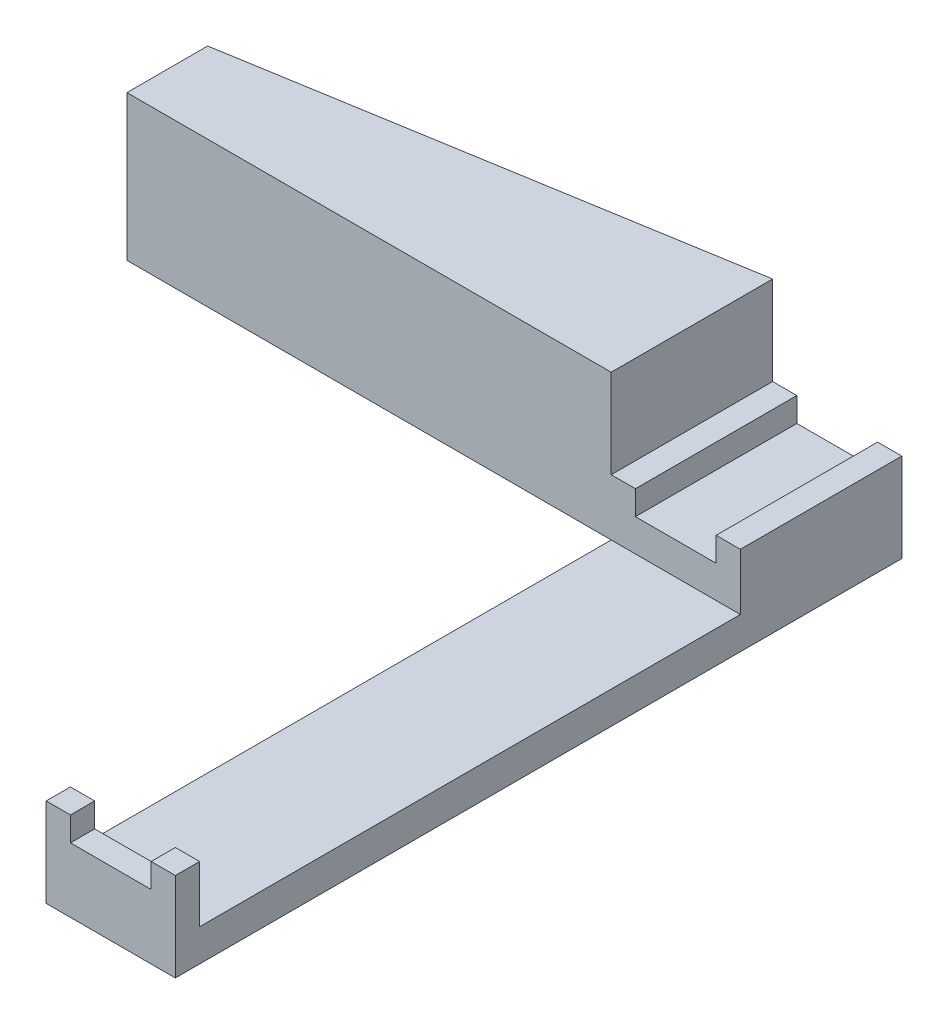
ISO-10303-21;
HEADER;
FILE_DESCRIPTION(('STEP AP214'),'2;1');
FILE_NAME('part.step','',(''),(''),'','','');
FILE_SCHEMA(('AUTOMOTIVE_DESIGN { 1 0 10303 214 1 1 1 1 }'));
ENDSEC;
DATA;
#1=APPLICATION_CONTEXT('core data for automotive mechanical design processes');
#2=APPLICATION_PROTOCOL_DEFINITION('international standard','automotive_design',2000,#1);
#3=PRODUCT_CONTEXT('',#1,'mechanical');
#4=PRODUCT('Part','Part','',(#3));
#5=PRODUCT_RELATED_PRODUCT_CATEGORY('part','',(#4));
#6=PRODUCT_DEFINITION_FORMATION('','',#4);
#7=PRODUCT_DEFINITION_CONTEXT('part definition',#1,'design');
#8=PRODUCT_DEFINITION('design','',#6,#7);
#9=PRODUCT_DEFINITION_SHAPE('','',#8);
#10=(LENGTH_UNIT() NAMED_UNIT(*) SI_UNIT(.MILLI.,.METRE.));
#11=(NAMED_UNIT(*) PLANE_ANGLE_UNIT() SI_UNIT($,.RADIAN.));
#12=(NAMED_UNIT(*) SI_UNIT($,.STERADIAN.) SOLID_ANGLE_UNIT());
#13=UNCERTAINTY_MEASURE_WITH_UNIT(LENGTH_MEASURE(1.E-05),#10,'distance_accuracy_value','');
#14=(GEOMETRIC_REPRESENTATION_CONTEXT(3) GLOBAL_UNCERTAINTY_ASSIGNED_CONTEXT((#13)) GLOBAL_UNIT_ASSIGNED_CONTEXT((#10,
#11,#12)) REPRESENTATION_CONTEXT('',''));
#15=CARTESIAN_POINT('',(0.,0.,0.));
#16=DIRECTION('',(0.,0.,1.));
#17=DIRECTION('',(1.,0.,0.));
#18=AXIS2_PLACEMENT_3D('',#15,#16,#17);
#19=CARTESIAN_POINT('',(0.,12.,-5.));
#20=DIRECTION('',(1.,0.,0.));
#21=DIRECTION('',(0.,0.,-1.));
#22=AXIS2_PLACEMENT_3D('',#19,#20,#21);
#23=PLANE('',#22);
#24=DIRECTION('',(0.,0.,-1.));
#25=VECTOR('',#24,1.);
#26=CARTESIAN_POINT('',(0.,5.,-3.));
#27=LINE('',#26,#25);
#28=CARTESIAN_POINT('',(0.,5.,-3.));
#29=VERTEX_POINT('',#28);
#30=CARTESIAN_POINT('',(0.,5.,-5.));
#31=VERTEX_POINT('',#30);
#32=EDGE_CURVE('E181',#29,#31,#27,.T.);
#33=ORIENTED_EDGE('',*,*,#32,.F.);
#34=DIRECTION('',(0.,-1.,0.));
#35=VECTOR('',#34,1.);
#36=CARTESIAN_POINT('',(0.,5.,-3.));
#37=LINE('',#36,#35);
#38=CARTESIAN_POINT('',(0.,2.,-3.));
#39=VERTEX_POINT('',#38);
#40=EDGE_CURVE('E381',#29,#39,#37,.T.);
#41=ORIENTED_EDGE('',*,*,#40,.T.);
#42=DIRECTION('',(0.,0.,-1.));
#43=VECTOR('',#42,1.);
#44=CARTESIAN_POINT('',(0.,2.,-5.));
#45=LINE('',#44,#43);
#46=CARTESIAN_POINT('',(0.,2.,0.));
#47=VERTEX_POINT('',#46);
#48=EDGE_CURVE('E372',#47,#39,#45,.T.);
#49=ORIENTED_EDGE('',*,*,#48,.F.);
#50=DIRECTION('',(0.,-1.,0.));
#51=VECTOR('',#50,1.);
#52=CARTESIAN_POINT('',(0.,12.,0.));
#53=LINE('',#52,#51);
#54=CARTESIAN_POINT('',(0.,11.,0.));
#55=VERTEX_POINT('',#54);
#56=EDGE_CURVE('E220',#55,#47,#53,.T.);
#57=ORIENTED_EDGE('',*,*,#56,.F.);
#58=DIRECTION('',(0.,0.,1.));
#59=VECTOR('',#58,1.);
#60=CARTESIAN_POINT('',(0.,11.,0.));
#61=LINE('',#60,#59);
#62=CARTESIAN_POINT('',(0.,11.,-5.));
#63=VERTEX_POINT('',#62);
#64=EDGE_CURVE('E205',#63,#55,#61,.T.);
#65=ORIENTED_EDGE('',*,*,#64,.F.);
#66=DIRECTION('',(0.,-1.,0.));
#67=VECTOR('',#66,1.);
#68=CARTESIAN_POINT('',(0.,12.,-5.));
#69=LINE('',#68,#67);
#70=EDGE_CURVE('E198',#63,#31,#69,.T.);
#71=ORIENTED_EDGE('',*,*,#70,.T.);
#72=EDGE_LOOP('',(#33,#41,#49,#57,#65,#71));
#73=FACE_BOUND('',#72,.T.);
#74=ADVANCED_FACE('F35',(#73),#23,.F.);
#75=CARTESIAN_POINT('',(0.,12.,0.));
#76=DIRECTION('',(0.,0.,-1.));
#77=DIRECTION('',(-1.,0.,0.));
#78=AXIS2_PLACEMENT_3D('',#75,#76,#77);
#79=PLANE('',#78);
#80=DIRECTION('',(1.,0.,0.));
#81=VECTOR('',#80,1.);
#82=CARTESIAN_POINT('',(30.,11.,0.));
#83=LINE('',#82,#81);
#84=CARTESIAN_POINT('',(30.,11.,0.));
#85=VERTEX_POINT('',#84);
#86=EDGE_CURVE('E49',#55,#85,#83,.T.);
#87=ORIENTED_EDGE('',*,*,#86,.F.);
#88=ORIENTED_EDGE('',*,*,#56,.T.);
#89=DIRECTION('',(-1.,0.,0.));
#90=VECTOR('',#89,1.);
#91=CARTESIAN_POINT('',(0.,2.,0.));
#92=LINE('',#91,#90);
#93=CARTESIAN_POINT('',(30.,2.,0.));
#94=VERTEX_POINT('',#93);
#95=EDGE_CURVE('E368',#94,#47,#92,.T.);
#96=ORIENTED_EDGE('',*,*,#95,.F.);
#97=DIRECTION('',(-1.,0.,0.));
#98=VECTOR('',#97,1.);
#99=CARTESIAN_POINT('',(30.,2.,0.));
#100=LINE('',#99,#98);
#101=CARTESIAN_POINT('',(38.,2.,0.));
#102=VERTEX_POINT('',#101);
#103=EDGE_CURVE('E251',#102,#94,#100,.T.);
#104=ORIENTED_EDGE('',*,*,#103,.F.);
#105=DIRECTION('',(0.,1.,0.));
#106=VECTOR('',#105,1.);
#107=CARTESIAN_POINT('',(38.,2.,0.));
#108=LINE('',#107,#106);
#109=CARTESIAN_POINT('',(38.,5.5,0.));
#110=VERTEX_POINT('',#109);
#111=EDGE_CURVE('E254',#102,#110,#108,.T.);
#112=ORIENTED_EDGE('',*,*,#111,.T.);
#113=DIRECTION('',(1.,0.,0.));
#114=VECTOR('',#113,1.);
#115=CARTESIAN_POINT('',(0.,5.5,0.));
#116=LINE('',#115,#114);
#117=CARTESIAN_POINT('',(36.5,5.5,0.));
#118=VERTEX_POINT('',#117);
#119=EDGE_CURVE('E291',#118,#110,#116,.T.);
#120=ORIENTED_EDGE('',*,*,#119,.F.);
#121=DIRECTION('',(0.,1.,0.));
#122=VECTOR('',#121,1.);
#123=CARTESIAN_POINT('',(36.5,4.,0.));
#124=LINE('',#123,#122);
#125=CARTESIAN_POINT('',(36.5,4.,0.));
#126=VERTEX_POINT('',#125);
#127=EDGE_CURVE('E323',#126,#118,#124,.T.);
#128=ORIENTED_EDGE('',*,*,#127,.F.);
#129=DIRECTION('',(1.,0.,0.));
#130=VECTOR('',#129,1.);
#131=CARTESIAN_POINT('',(31.5,4.,0.));
#132=LINE('',#131,#130);
#133=CARTESIAN_POINT('',(31.5,4.,0.));
#134=VERTEX_POINT('',#133);
#135=EDGE_CURVE('E339',#134,#126,#132,.T.);
#136=ORIENTED_EDGE('',*,*,#135,.F.);
#137=DIRECTION('',(0.,1.,0.));
#138=VECTOR('',#137,1.);
#139=CARTESIAN_POINT('',(31.5,4.,0.));
#140=LINE('',#139,#138);
#141=CARTESIAN_POINT('',(31.5,5.5,0.));
#142=VERTEX_POINT('',#141);
#143=EDGE_CURVE('E320',#134,#142,#140,.T.);
#144=ORIENTED_EDGE('',*,*,#143,.T.);
#145=CARTESIAN_POINT('',(30.,5.5,0.));
#146=VERTEX_POINT('',#145);
#147=EDGE_CURVE('E294',#146,#142,#116,.T.);
#148=ORIENTED_EDGE('',*,*,#147,.F.);
#149=DIRECTION('',(0.,1.,0.));
#150=VECTOR('',#149,1.);
#151=CARTESIAN_POINT('',(30.,12.,0.));
#152=LINE('',#151,#150);
#153=EDGE_CURVE('E302',#146,#85,#152,.T.);
#154=ORIENTED_EDGE('',*,*,#153,.T.);
#155=EDGE_LOOP('',(#87,#88,#96,#104,#112,#120,#128,#136,#144,#148,#154));
#156=FACE_BOUND('',#155,.T.);
#157=ADVANCED_FACE('F312',(#156),#79,.F.);
#158=CARTESIAN_POINT('',(30.,12.,-10.));
#159=DIRECTION('',(0.164398987305357,0.,0.986393923832144));
#160=DIRECTION('',(0.986393923832144,0.,-0.164398987305357));
#161=AXIS2_PLACEMENT_3D('',#158,#159,#160);
#162=PLANE('',#161);
#163=DIRECTION('',(0.,-1.,0.));
#164=VECTOR('',#163,1.);
#165=CARTESIAN_POINT('',(30.,12.,-10.));
#166=LINE('',#165,#164);
#167=CARTESIAN_POINT('',(30.,5.5,-10.));
#168=VERTEX_POINT('',#167);
#169=CARTESIAN_POINT('',(30.,5.,-10.));
#170=VERTEX_POINT('',#169);
#171=EDGE_CURVE('E200',#168,#170,#166,.T.);
#172=ORIENTED_EDGE('',*,*,#171,.T.);
#173=DIRECTION('',(0.986393923832144,0.,-0.164398987305357));
#174=VECTOR('',#173,1.);
#175=CARTESIAN_POINT('',(0.,5.,-5.));
#176=LINE('',#175,#174);
#177=EDGE_CURVE('E185',#31,#170,#176,.T.);
#178=ORIENTED_EDGE('',*,*,#177,.F.);
#179=ORIENTED_EDGE('',*,*,#70,.F.);
#180=DIRECTION('',(-0.986393923832144,0.,0.164398987305357));
#181=VECTOR('',#180,1.);
#182=CARTESIAN_POINT('',(0.,11.,-5.));
#183=LINE('',#182,#181);
#184=CARTESIAN_POINT('',(30.,11.,-10.));
#185=VERTEX_POINT('',#184);
#186=EDGE_CURVE('E375',#185,#63,#183,.T.);
#187=ORIENTED_EDGE('',*,*,#186,.F.);
#188=EDGE_CURVE('E208',#185,#168,#166,.T.);
#189=ORIENTED_EDGE('',*,*,#188,.T.);
#190=EDGE_LOOP('',(#172,#178,#179,#187,#189));
#191=FACE_BOUND('',#190,.T.);
#192=ADVANCED_FACE('F196',(#191),#162,.F.);
#193=CARTESIAN_POINT('',(30.,5.5,-10.));
#194=DIRECTION('',(-1.,0.,0.));
#195=DIRECTION('',(0.,0.,1.));
#196=AXIS2_PLACEMENT_3D('',#193,#194,#195);
#197=PLANE('',#196);
#198=DIRECTION('',(0.,0.,-1.));
#199=VECTOR('',#198,1.);
#200=CARTESIAN_POINT('',(30.,11.,-10.));
#201=LINE('',#200,#199);
#202=EDGE_CURVE('E377',#85,#185,#201,.T.);
#203=ORIENTED_EDGE('',*,*,#202,.F.);
#204=ORIENTED_EDGE('',*,*,#153,.F.);
#205=DIRECTION('',(0.,0.,1.));
#206=VECTOR('',#205,1.);
#207=CARTESIAN_POINT('',(30.,5.5,-10.));
#208=LINE('',#207,#206);
#209=EDGE_CURVE('E243',#168,#146,#208,.T.);
#210=ORIENTED_EDGE('',*,*,#209,.F.);
#211=ORIENTED_EDGE('',*,*,#188,.F.);
#212=EDGE_LOOP('',(#203,#204,#210,#211));
#213=FACE_BOUND('',#212,.T.);
#214=ADVANCED_FACE('F419',(#213),#197,.F.);
#215=CARTESIAN_POINT('',(0.,5.5,0.));
#216=DIRECTION('',(0.,1.,0.));
#217=DIRECTION('',(0.,0.,1.));
#218=AXIS2_PLACEMENT_3D('',#215,#216,#217);
#219=PLANE('',#218);
#220=DIRECTION('',(0.,0.,1.));
#221=VECTOR('',#220,1.);
#222=CARTESIAN_POINT('',(31.5,5.5,33.5));
#223=LINE('',#222,#221);
#224=CARTESIAN_POINT('',(31.5,5.5,33.5));
#225=VERTEX_POINT('',#224);
#226=CARTESIAN_POINT('',(31.5,5.5,35.));
#227=VERTEX_POINT('',#226);
#228=EDGE_CURVE('E232',#225,#227,#223,.T.);
#229=ORIENTED_EDGE('',*,*,#228,.F.);
#230=DIRECTION('',(-1.,0.,0.));
#231=VECTOR('',#230,1.);
#232=CARTESIAN_POINT('',(30.,5.5,33.5));
#233=LINE('',#232,#231);
#234=CARTESIAN_POINT('',(30.,5.5,33.5));
#235=VERTEX_POINT('',#234);
#236=EDGE_CURVE('E42',#225,#235,#233,.T.);
#237=ORIENTED_EDGE('',*,*,#236,.T.);
#238=CARTESIAN_POINT('',(30.,5.5,35.));
#239=VERTEX_POINT('',#238);
#240=EDGE_CURVE('E230',#235,#239,#208,.T.);
#241=ORIENTED_EDGE('',*,*,#240,.T.);
#242=DIRECTION('',(1.,0.,0.));
#243=VECTOR('',#242,1.);
#244=CARTESIAN_POINT('',(30.,5.5,35.));
#245=LINE('',#244,#243);
#246=EDGE_CURVE('E316',#239,#227,#245,.T.);
#247=ORIENTED_EDGE('',*,*,#246,.T.);
#248=EDGE_LOOP('',(#229,#237,#241,#247));
#249=FACE_BOUND('',#248,.T.);
#250=ADVANCED_FACE('F228',(#249),#219,.T.);
#251=DIRECTION('',(0.,0.,1.));
#252=VECTOR('',#251,1.);
#253=CARTESIAN_POINT('',(31.5,5.5,-10.));
#254=LINE('',#253,#252);
#255=CARTESIAN_POINT('',(31.5,5.5,-10.));
#256=VERTEX_POINT('',#255);
#257=EDGE_CURVE('E331',#256,#142,#254,.T.);
#258=ORIENTED_EDGE('',*,*,#257,.F.);
#259=DIRECTION('',(-1.,0.,0.));
#260=VECTOR('',#259,1.);
#261=CARTESIAN_POINT('',(30.,5.5,-10.));
#262=LINE('',#261,#260);
#263=EDGE_CURVE('E292',#256,#168,#262,.T.);
#264=ORIENTED_EDGE('',*,*,#263,.T.);
#265=ORIENTED_EDGE('',*,*,#209,.T.);
#266=ORIENTED_EDGE('',*,*,#147,.T.);
#267=EDGE_LOOP('',(#258,#264,#265,#266));
#268=FACE_BOUND('',#267,.T.);
#269=ADVANCED_FACE('F407',(#268),#219,.T.);
#270=CARTESIAN_POINT('',(30.,12.,0.));
#271=DIRECTION('',(1.,0.,0.));
#272=DIRECTION('',(0.,0.,-1.));
#273=AXIS2_PLACEMENT_3D('',#270,#271,#272);
#274=PLANE('',#273);
#275=ORIENTED_EDGE('',*,*,#240,.F.);
#276=DIRECTION('',(0.,1.,0.));
#277=VECTOR('',#276,1.);
#278=CARTESIAN_POINT('',(30.,2.,33.5));
#279=LINE('',#278,#277);
#280=CARTESIAN_POINT('',(30.,2.,33.5));
#281=VERTEX_POINT('',#280);
#282=EDGE_CURVE('E241',#281,#235,#279,.T.);
#283=ORIENTED_EDGE('',*,*,#282,.F.);
#284=DIRECTION('',(0.,0.,1.));
#285=VECTOR('',#284,1.);
#286=CARTESIAN_POINT('',(30.,2.,0.));
#287=LINE('',#286,#285);
#288=EDGE_CURVE('E305',#94,#281,#287,.T.);
#289=ORIENTED_EDGE('',*,*,#288,.F.);
#290=DIRECTION('',(0.,0.,1.));
#291=VECTOR('',#290,1.);
#292=CARTESIAN_POINT('',(30.,2.,0.));
#293=LINE('',#292,#291);
#294=CARTESIAN_POINT('',(30.,2.,-3.));
#295=VERTEX_POINT('',#294);
#296=EDGE_CURVE('E370',#295,#94,#293,.T.);
#297=ORIENTED_EDGE('',*,*,#296,.F.);
#298=DIRECTION('',(0.,-1.,0.));
#299=VECTOR('',#298,1.);
#300=CARTESIAN_POINT('',(30.,5.,-3.));
#301=LINE('',#300,#299);
#302=CARTESIAN_POINT('',(30.,5.,-3.));
#303=VERTEX_POINT('',#302);
#304=EDGE_CURVE('E382',#303,#295,#301,.T.);
#305=ORIENTED_EDGE('',*,*,#304,.F.);
#306=DIRECTION('',(0.,0.,1.));
#307=VECTOR('',#306,1.);
#308=CARTESIAN_POINT('',(30.,5.,-10.));
#309=LINE('',#308,#307);
#310=EDGE_CURVE('E201',#170,#303,#309,.T.);
#311=ORIENTED_EDGE('',*,*,#310,.F.);
#312=DIRECTION('',(0.,-1.,0.));
#313=VECTOR('',#312,1.);
#314=CARTESIAN_POINT('',(30.,2.,-10.));
#315=LINE('',#314,#313);
#316=CARTESIAN_POINT('',(30.,0.,-10.));
#317=VERTEX_POINT('',#316);
#318=EDGE_CURVE('E281',#170,#317,#315,.T.);
#319=ORIENTED_EDGE('',*,*,#318,.T.);
#320=DIRECTION('',(0.,0.,1.));
#321=VECTOR('',#320,1.);
#322=CARTESIAN_POINT('',(30.,0.,0.));
#323=LINE('',#322,#321);
#324=CARTESIAN_POINT('',(30.,0.,35.));
#325=VERTEX_POINT('',#324);
#326=EDGE_CURVE('E261',#317,#325,#323,.T.);
#327=ORIENTED_EDGE('',*,*,#326,.T.);
#328=DIRECTION('',(0.,-1.,0.));
#329=VECTOR('',#328,1.);
#330=CARTESIAN_POINT('',(30.,12.,35.));
#331=LINE('',#330,#329);
#332=EDGE_CURVE('E219',#239,#325,#331,.T.);
#333=ORIENTED_EDGE('',*,*,#332,.F.);
#334=EDGE_LOOP('',(#275,#283,#289,#297,#305,#311,#319,#327,#333));
#335=FACE_BOUND('',#334,.T.);
#336=ADVANCED_FACE('F239',(#335),#274,.F.);
#337=CARTESIAN_POINT('',(30.,12.,35.));
#338=DIRECTION('',(0.,0.,-1.));
#339=DIRECTION('',(-1.,0.,0.));
#340=AXIS2_PLACEMENT_3D('',#337,#338,#339);
#341=PLANE('',#340);
#342=DIRECTION('',(1.,0.,0.));
#343=VECTOR('',#342,1.);
#344=CARTESIAN_POINT('',(31.5,4.,35.));
#345=LINE('',#344,#343);
#346=CARTESIAN_POINT('',(31.5,4.,35.));
#347=VERTEX_POINT('',#346);
#348=CARTESIAN_POINT('',(36.5,4.,35.));
#349=VERTEX_POINT('',#348);
#350=EDGE_CURVE('E362',#347,#349,#345,.T.);
#351=ORIENTED_EDGE('',*,*,#350,.F.);
#352=DIRECTION('',(0.,1.,0.));
#353=VECTOR('',#352,1.);
#354=CARTESIAN_POINT('',(31.5,4.,35.));
#355=LINE('',#354,#353);
#356=EDGE_CURVE('E344',#347,#227,#355,.T.);
#357=ORIENTED_EDGE('',*,*,#356,.T.);
#358=ORIENTED_EDGE('',*,*,#246,.F.);
#359=ORIENTED_EDGE('',*,*,#332,.T.);
#360=DIRECTION('',(1.,0.,0.));
#361=VECTOR('',#360,1.);
#362=CARTESIAN_POINT('',(30.,0.,35.));
#363=LINE('',#362,#361);
#364=CARTESIAN_POINT('',(38.,0.,35.));
#365=VERTEX_POINT('',#364);
#366=EDGE_CURVE('E263',#325,#365,#363,.T.);
#367=ORIENTED_EDGE('',*,*,#366,.T.);
#368=DIRECTION('',(0.,-1.,0.));
#369=VECTOR('',#368,1.);
#370=CARTESIAN_POINT('',(38.,12.,35.));
#371=LINE('',#370,#369);
#372=CARTESIAN_POINT('',(38.,5.5,35.));
#373=VERTEX_POINT('',#372);
#374=EDGE_CURVE('E217',#373,#365,#371,.T.);
#375=ORIENTED_EDGE('',*,*,#374,.F.);
#376=CARTESIAN_POINT('',(36.5,5.5,35.));
#377=VERTEX_POINT('',#376);
#378=EDGE_CURVE('E317',#377,#373,#245,.T.);
#379=ORIENTED_EDGE('',*,*,#378,.F.);
#380=DIRECTION('',(0.,1.,0.));
#381=VECTOR('',#380,1.);
#382=CARTESIAN_POINT('',(36.5,4.,35.));
#383=LINE('',#382,#381);
#384=EDGE_CURVE('E57',#349,#377,#383,.T.);
#385=ORIENTED_EDGE('',*,*,#384,.F.);
#386=EDGE_LOOP('',(#351,#357,#358,#359,#367,#375,#379,#385));
#387=FACE_BOUND('',#386,.T.);
#388=ADVANCED_FACE('F424',(#387),#341,.F.);
#389=CARTESIAN_POINT('',(38.,12.,35.));
#390=DIRECTION('',(-1.,0.,0.));
#391=DIRECTION('',(0.,0.,1.));
#392=AXIS2_PLACEMENT_3D('',#389,#390,#391);
#393=PLANE('',#392);
#394=DIRECTION('',(0.,0.,-1.));
#395=VECTOR('',#394,1.);
#396=CARTESIAN_POINT('',(38.,5.5,-10.));
#397=LINE('',#396,#395);
#398=CARTESIAN_POINT('',(38.,5.5,33.5));
#399=VERTEX_POINT('',#398);
#400=EDGE_CURVE('E297',#373,#399,#397,.T.);
#401=ORIENTED_EDGE('',*,*,#400,.F.);
#402=ORIENTED_EDGE('',*,*,#374,.T.);
#403=DIRECTION('',(0.,0.,-1.));
#404=VECTOR('',#403,1.);
#405=CARTESIAN_POINT('',(38.,0.,35.));
#406=LINE('',#405,#404);
#407=CARTESIAN_POINT('',(38.,0.,-10.));
#408=VERTEX_POINT('',#407);
#409=EDGE_CURVE('E211',#365,#408,#406,.T.);
#410=ORIENTED_EDGE('',*,*,#409,.T.);
#411=DIRECTION('',(0.,-1.,0.));
#412=VECTOR('',#411,1.);
#413=CARTESIAN_POINT('',(38.,12.,-10.));
#414=LINE('',#413,#412);
#415=CARTESIAN_POINT('',(38.,5.5,-10.));
#416=VERTEX_POINT('',#415);
#417=EDGE_CURVE('E215',#416,#408,#414,.T.);
#418=ORIENTED_EDGE('',*,*,#417,.F.);
#419=EDGE_CURVE('E315',#110,#416,#397,.T.);
#420=ORIENTED_EDGE('',*,*,#419,.F.);
#421=ORIENTED_EDGE('',*,*,#111,.F.);
#422=DIRECTION('',(0.,0.,-1.));
#423=VECTOR('',#422,1.);
#424=CARTESIAN_POINT('',(38.,2.,0.));
#425=LINE('',#424,#423);
#426=CARTESIAN_POINT('',(38.,2.,33.5));
#427=VERTEX_POINT('',#426);
#428=EDGE_CURVE('E257',#427,#102,#425,.T.);
#429=ORIENTED_EDGE('',*,*,#428,.F.);
#430=DIRECTION('',(0.,1.,0.));
#431=VECTOR('',#430,1.);
#432=CARTESIAN_POINT('',(38.,2.,33.5));
#433=LINE('',#432,#431);
#434=EDGE_CURVE('E250',#427,#399,#433,.T.);
#435=ORIENTED_EDGE('',*,*,#434,.T.);
#436=EDGE_LOOP('',(#401,#402,#410,#418,#420,#421,#429,#435));
#437=FACE_BOUND('',#436,.T.);
#438=ADVANCED_FACE('F271',(#437),#393,.F.);
#439=CARTESIAN_POINT('',(38.,12.,-10.));
#440=DIRECTION('',(0.,0.,1.));
#441=DIRECTION('',(1.,0.,0.));
#442=AXIS2_PLACEMENT_3D('',#439,#440,#441);
#443=PLANE('',#442);
#444=ORIENTED_EDGE('',*,*,#263,.F.);
#445=DIRECTION('',(0.,1.,0.));
#446=VECTOR('',#445,1.);
#447=CARTESIAN_POINT('',(31.5,4.,-10.));
#448=LINE('',#447,#446);
#449=CARTESIAN_POINT('',(31.5,4.,-10.));
#450=VERTEX_POINT('',#449);
#451=EDGE_CURVE('E244',#450,#256,#448,.T.);
#452=ORIENTED_EDGE('',*,*,#451,.F.);
#453=DIRECTION('',(-1.,0.,0.));
#454=VECTOR('',#453,1.);
#455=CARTESIAN_POINT('',(31.5,4.,-10.));
#456=LINE('',#455,#454);
#457=CARTESIAN_POINT('',(36.5,4.,-10.));
#458=VERTEX_POINT('',#457);
#459=EDGE_CURVE('E324',#458,#450,#456,.T.);
#460=ORIENTED_EDGE('',*,*,#459,.F.);
#461=DIRECTION('',(0.,1.,0.));
#462=VECTOR('',#461,1.);
#463=CARTESIAN_POINT('',(36.5,4.,-10.));
#464=LINE('',#463,#462);
#465=CARTESIAN_POINT('',(36.5,5.5,-10.));
#466=VERTEX_POINT('',#465);
#467=EDGE_CURVE('E288',#458,#466,#464,.T.);
#468=ORIENTED_EDGE('',*,*,#467,.T.);
#469=EDGE_CURVE('E286',#416,#466,#262,.T.);
#470=ORIENTED_EDGE('',*,*,#469,.F.);
#471=ORIENTED_EDGE('',*,*,#417,.T.);
#472=DIRECTION('',(-1.,0.,0.));
#473=VECTOR('',#472,1.);
#474=CARTESIAN_POINT('',(38.,0.,-10.));
#475=LINE('',#474,#473);
#476=EDGE_CURVE('E206',#408,#317,#475,.T.);
#477=ORIENTED_EDGE('',*,*,#476,.T.);
#478=ORIENTED_EDGE('',*,*,#318,.F.);
#479=ORIENTED_EDGE('',*,*,#171,.F.);
#480=EDGE_LOOP('',(#444,#452,#460,#468,#470,#471,#477,#478,#479));
#481=FACE_BOUND('',#480,.T.);
#482=ADVANCED_FACE('F280',(#481),#443,.F.);
#483=CARTESIAN_POINT('',(30.,2.,33.5));
#484=DIRECTION('',(0.,0.,1.));
#485=DIRECTION('',(1.,0.,0.));
#486=AXIS2_PLACEMENT_3D('',#483,#484,#485);
#487=PLANE('',#486);
#488=ORIENTED_EDGE('',*,*,#236,.F.);
#489=DIRECTION('',(0.,1.,0.));
#490=VECTOR('',#489,1.);
#491=CARTESIAN_POINT('',(31.5,4.,33.5));
#492=LINE('',#491,#490);
#493=CARTESIAN_POINT('',(31.5,4.,33.5));
#494=VERTEX_POINT('',#493);
#495=EDGE_CURVE('E333',#494,#225,#492,.T.);
#496=ORIENTED_EDGE('',*,*,#495,.F.);
#497=DIRECTION('',(-1.,0.,0.));
#498=VECTOR('',#497,1.);
#499=CARTESIAN_POINT('',(31.5,4.,33.5));
#500=LINE('',#499,#498);
#501=CARTESIAN_POINT('',(36.5,4.,33.5));
#502=VERTEX_POINT('',#501);
#503=EDGE_CURVE('E347',#502,#494,#500,.T.);
#504=ORIENTED_EDGE('',*,*,#503,.F.);
#505=DIRECTION('',(0.,1.,0.));
#506=VECTOR('',#505,1.);
#507=CARTESIAN_POINT('',(36.5,4.,33.5));
#508=LINE('',#507,#506);
#509=CARTESIAN_POINT('',(36.5,5.5,33.5));
#510=VERTEX_POINT('',#509);
#511=EDGE_CURVE('E349',#502,#510,#508,.T.);
#512=ORIENTED_EDGE('',*,*,#511,.T.);
#513=EDGE_CURVE('E11',#399,#510,#233,.T.);
#514=ORIENTED_EDGE('',*,*,#513,.F.);
#515=ORIENTED_EDGE('',*,*,#434,.F.);
#516=DIRECTION('',(1.,0.,0.));
#517=VECTOR('',#516,1.);
#518=CARTESIAN_POINT('',(30.,2.,33.5));
#519=LINE('',#518,#517);
#520=EDGE_CURVE('E248',#281,#427,#519,.T.);
#521=ORIENTED_EDGE('',*,*,#520,.F.);
#522=ORIENTED_EDGE('',*,*,#282,.T.);
#523=EDGE_LOOP('',(#488,#496,#504,#512,#514,#515,#521,#522));
#524=FACE_BOUND('',#523,.T.);
#525=ADVANCED_FACE('F246',(#524),#487,.F.);
#526=CARTESIAN_POINT('',(0.,0.,0.));
#527=DIRECTION('',(0.,1.,0.));
#528=DIRECTION('',(0.,0.,1.));
#529=AXIS2_PLACEMENT_3D('',#526,#527,#528);
#530=PLANE('',#529);
#531=ORIENTED_EDGE('',*,*,#326,.F.);
#532=ORIENTED_EDGE('',*,*,#476,.F.);
#533=ORIENTED_EDGE('',*,*,#409,.F.);
#534=ORIENTED_EDGE('',*,*,#366,.F.);
#535=EDGE_LOOP('',(#531,#532,#533,#534));
#536=FACE_BOUND('',#535,.T.);
#537=ADVANCED_FACE('F276',(#536),#530,.F.);
#538=CARTESIAN_POINT('',(0.,2.,0.));
#539=DIRECTION('',(0.,1.,0.));
#540=DIRECTION('',(0.,0.,1.));
#541=AXIS2_PLACEMENT_3D('',#538,#539,#540);
#542=PLANE('',#541);
#543=ORIENTED_EDGE('',*,*,#288,.T.);
#544=ORIENTED_EDGE('',*,*,#520,.T.);
#545=ORIENTED_EDGE('',*,*,#428,.T.);
#546=ORIENTED_EDGE('',*,*,#103,.T.);
#547=EDGE_LOOP('',(#543,#544,#545,#546));
#548=FACE_BOUND('',#547,.T.);
#549=ADVANCED_FACE('F395',(#548),#542,.T.);
#550=DIRECTION('',(0.,0.,-1.));
#551=VECTOR('',#550,1.);
#552=CARTESIAN_POINT('',(36.5,5.5,33.5));
#553=LINE('',#552,#551);
#554=EDGE_CURVE('E353',#377,#510,#553,.T.);
#555=ORIENTED_EDGE('',*,*,#554,.F.);
#556=ORIENTED_EDGE('',*,*,#378,.T.);
#557=ORIENTED_EDGE('',*,*,#400,.T.);
#558=ORIENTED_EDGE('',*,*,#513,.T.);
#559=EDGE_LOOP('',(#555,#556,#557,#558));
#560=FACE_BOUND('',#559,.T.);
#561=ADVANCED_FACE('F397',(#560),#219,.T.);
#562=DIRECTION('',(0.,0.,-1.));
#563=VECTOR('',#562,1.);
#564=CARTESIAN_POINT('',(36.5,5.5,-10.));
#565=LINE('',#564,#563);
#566=EDGE_CURVE('E328',#118,#466,#565,.T.);
#567=ORIENTED_EDGE('',*,*,#566,.F.);
#568=ORIENTED_EDGE('',*,*,#119,.T.);
#569=ORIENTED_EDGE('',*,*,#419,.T.);
#570=ORIENTED_EDGE('',*,*,#469,.T.);
#571=EDGE_LOOP('',(#567,#568,#569,#570));
#572=FACE_BOUND('',#571,.T.);
#573=ADVANCED_FACE('F404',(#572),#219,.T.);
#574=CARTESIAN_POINT('',(31.5,4.,-10.));
#575=DIRECTION('',(-1.,0.,0.));
#576=DIRECTION('',(0.,0.,1.));
#577=AXIS2_PLACEMENT_3D('',#574,#575,#576);
#578=PLANE('',#577);
#579=ORIENTED_EDGE('',*,*,#257,.T.);
#580=ORIENTED_EDGE('',*,*,#143,.F.);
#581=DIRECTION('',(0.,0.,1.));
#582=VECTOR('',#581,1.);
#583=CARTESIAN_POINT('',(31.5,4.,-10.));
#584=LINE('',#583,#582);
#585=EDGE_CURVE('E330',#450,#134,#584,.T.);
#586=ORIENTED_EDGE('',*,*,#585,.F.);
#587=ORIENTED_EDGE('',*,*,#451,.T.);
#588=EDGE_LOOP('',(#579,#580,#586,#587));
#589=FACE_BOUND('',#588,.T.);
#590=ADVANCED_FACE('F460',(#589),#578,.F.);
#591=CARTESIAN_POINT('',(36.5,4.,-10.));
#592=DIRECTION('',(1.,0.,0.));
#593=DIRECTION('',(0.,0.,-1.));
#594=AXIS2_PLACEMENT_3D('',#591,#592,#593);
#595=PLANE('',#594);
#596=ORIENTED_EDGE('',*,*,#566,.T.);
#597=ORIENTED_EDGE('',*,*,#467,.F.);
#598=DIRECTION('',(0.,0.,-1.));
#599=VECTOR('',#598,1.);
#600=CARTESIAN_POINT('',(36.5,4.,-10.));
#601=LINE('',#600,#599);
#602=EDGE_CURVE('E336',#126,#458,#601,.T.);
#603=ORIENTED_EDGE('',*,*,#602,.F.);
#604=ORIENTED_EDGE('',*,*,#127,.T.);
#605=EDGE_LOOP('',(#596,#597,#603,#604));
#606=FACE_BOUND('',#605,.T.);
#607=ADVANCED_FACE('F467',(#606),#595,.F.);
#608=CARTESIAN_POINT('',(0.,4.,0.));
#609=DIRECTION('',(0.,1.,0.));
#610=DIRECTION('',(0.,0.,1.));
#611=AXIS2_PLACEMENT_3D('',#608,#609,#610);
#612=PLANE('',#611);
#613=ORIENTED_EDGE('',*,*,#585,.T.);
#614=ORIENTED_EDGE('',*,*,#135,.T.);
#615=ORIENTED_EDGE('',*,*,#602,.T.);
#616=ORIENTED_EDGE('',*,*,#459,.T.);
#617=EDGE_LOOP('',(#613,#614,#615,#616));
#618=FACE_BOUND('',#617,.T.);
#619=ADVANCED_FACE('F475',(#618),#612,.T.);
#620=CARTESIAN_POINT('',(31.5,4.,33.5));
#621=DIRECTION('',(-1.,0.,0.));
#622=DIRECTION('',(0.,0.,1.));
#623=AXIS2_PLACEMENT_3D('',#620,#621,#622);
#624=PLANE('',#623);
#625=ORIENTED_EDGE('',*,*,#228,.T.);
#626=ORIENTED_EDGE('',*,*,#356,.F.);
#627=DIRECTION('',(0.,0.,1.));
#628=VECTOR('',#627,1.);
#629=CARTESIAN_POINT('',(31.5,4.,33.5));
#630=LINE('',#629,#628);
#631=EDGE_CURVE('E355',#494,#347,#630,.T.);
#632=ORIENTED_EDGE('',*,*,#631,.F.);
#633=ORIENTED_EDGE('',*,*,#495,.T.);
#634=EDGE_LOOP('',(#625,#626,#632,#633));
#635=FACE_BOUND('',#634,.T.);
#636=ADVANCED_FACE('F483',(#635),#624,.F.);
#637=CARTESIAN_POINT('',(36.5,4.,33.5));
#638=DIRECTION('',(1.,0.,0.));
#639=DIRECTION('',(0.,0.,-1.));
#640=AXIS2_PLACEMENT_3D('',#637,#638,#639);
#641=PLANE('',#640);
#642=ORIENTED_EDGE('',*,*,#554,.T.);
#643=ORIENTED_EDGE('',*,*,#511,.F.);
#644=DIRECTION('',(0.,0.,-1.));
#645=VECTOR('',#644,1.);
#646=CARTESIAN_POINT('',(36.5,4.,33.5));
#647=LINE('',#646,#645);
#648=EDGE_CURVE('E359',#349,#502,#647,.T.);
#649=ORIENTED_EDGE('',*,*,#648,.F.);
#650=ORIENTED_EDGE('',*,*,#384,.T.);
#651=EDGE_LOOP('',(#642,#643,#649,#650));
#652=FACE_BOUND('',#651,.T.);
#653=ADVANCED_FACE('F491',(#652),#641,.F.);
#654=CARTESIAN_POINT('',(0.,4.,0.));
#655=DIRECTION('',(0.,1.,0.));
#656=DIRECTION('',(0.,0.,1.));
#657=AXIS2_PLACEMENT_3D('',#654,#655,#656);
#658=PLANE('',#657);
#659=ORIENTED_EDGE('',*,*,#631,.T.);
#660=ORIENTED_EDGE('',*,*,#350,.T.);
#661=ORIENTED_EDGE('',*,*,#648,.T.);
#662=ORIENTED_EDGE('',*,*,#503,.T.);
#663=EDGE_LOOP('',(#659,#660,#661,#662));
#664=FACE_BOUND('',#663,.T.);
#665=ADVANCED_FACE('F499',(#664),#658,.T.);
#666=CARTESIAN_POINT('',(0.,2.,0.));
#667=DIRECTION('',(0.,1.,0.));
#668=DIRECTION('',(0.,0.,1.));
#669=AXIS2_PLACEMENT_3D('',#666,#667,#668);
#670=PLANE('',#669);
#671=ORIENTED_EDGE('',*,*,#48,.T.);
#672=DIRECTION('',(-1.,0.,0.));
#673=VECTOR('',#672,1.);
#674=CARTESIAN_POINT('',(30.,2.,-3.));
#675=LINE('',#674,#673);
#676=EDGE_CURVE('E192',#295,#39,#675,.T.);
#677=ORIENTED_EDGE('',*,*,#676,.F.);
#678=ORIENTED_EDGE('',*,*,#296,.T.);
#679=ORIENTED_EDGE('',*,*,#95,.T.);
#680=EDGE_LOOP('',(#671,#677,#678,#679));
#681=FACE_BOUND('',#680,.T.);
#682=ADVANCED_FACE('F392',(#681),#670,.F.);
#683=CARTESIAN_POINT('',(0.,11.,0.));
#684=DIRECTION('',(0.,1.,0.));
#685=DIRECTION('',(0.,0.,1.));
#686=AXIS2_PLACEMENT_3D('',#683,#684,#685);
#687=PLANE('',#686);
#688=ORIENTED_EDGE('',*,*,#64,.T.);
#689=ORIENTED_EDGE('',*,*,#86,.T.);
#690=ORIENTED_EDGE('',*,*,#202,.T.);
#691=ORIENTED_EDGE('',*,*,#186,.T.);
#692=EDGE_LOOP('',(#688,#689,#690,#691));
#693=FACE_BOUND('',#692,.T.);
#694=ADVANCED_FACE('F534',(#693),#687,.T.);
#695=CARTESIAN_POINT('',(30.,5.,-3.));
#696=DIRECTION('',(0.,0.,1.));
#697=DIRECTION('',(1.,0.,0.));
#698=AXIS2_PLACEMENT_3D('',#695,#696,#697);
#699=PLANE('',#698);
#700=ORIENTED_EDGE('',*,*,#676,.T.);
#701=ORIENTED_EDGE('',*,*,#40,.F.);
#702=DIRECTION('',(-1.,0.,0.));
#703=VECTOR('',#702,1.);
#704=CARTESIAN_POINT('',(30.,5.,-3.));
#705=LINE('',#704,#703);
#706=EDGE_CURVE('E188',#303,#29,#705,.T.);
#707=ORIENTED_EDGE('',*,*,#706,.F.);
#708=ORIENTED_EDGE('',*,*,#304,.T.);
#709=EDGE_LOOP('',(#700,#701,#707,#708));
#710=FACE_BOUND('',#709,.T.);
#711=ADVANCED_FACE('F388',(#710),#699,.F.);
#712=CARTESIAN_POINT('',(0.,5.,0.));
#713=DIRECTION('',(0.,1.,0.));
#714=DIRECTION('',(0.,0.,1.));
#715=AXIS2_PLACEMENT_3D('',#712,#713,#714);
#716=PLANE('',#715);
#717=ORIENTED_EDGE('',*,*,#32,.T.);
#718=ORIENTED_EDGE('',*,*,#177,.T.);
#719=ORIENTED_EDGE('',*,*,#310,.T.);
#720=ORIENTED_EDGE('',*,*,#706,.T.);
#721=EDGE_LOOP('',(#717,#718,#719,#720));
#722=FACE_BOUND('',#721,.T.);
#723=ADVANCED_FACE('F183',(#722),#716,.F.);
#724=CLOSED_SHELL('',(#74,#157,#192,#214,#250,#269,#336,#388,#438,#482,#525,#537,#549,#561,#573,
#590,#607,#619,#636,#653,#665,#682,#694,#711,#723));
#725=MANIFOLD_SOLID_BREP('B2',#724);
#726=ADVANCED_BREP_SHAPE_REPRESENTATION('',(#18,#725),#14);
#727=SHAPE_DEFINITION_REPRESENTATION(#9,#726);
ENDSEC;
END-ISO-10303-21;
